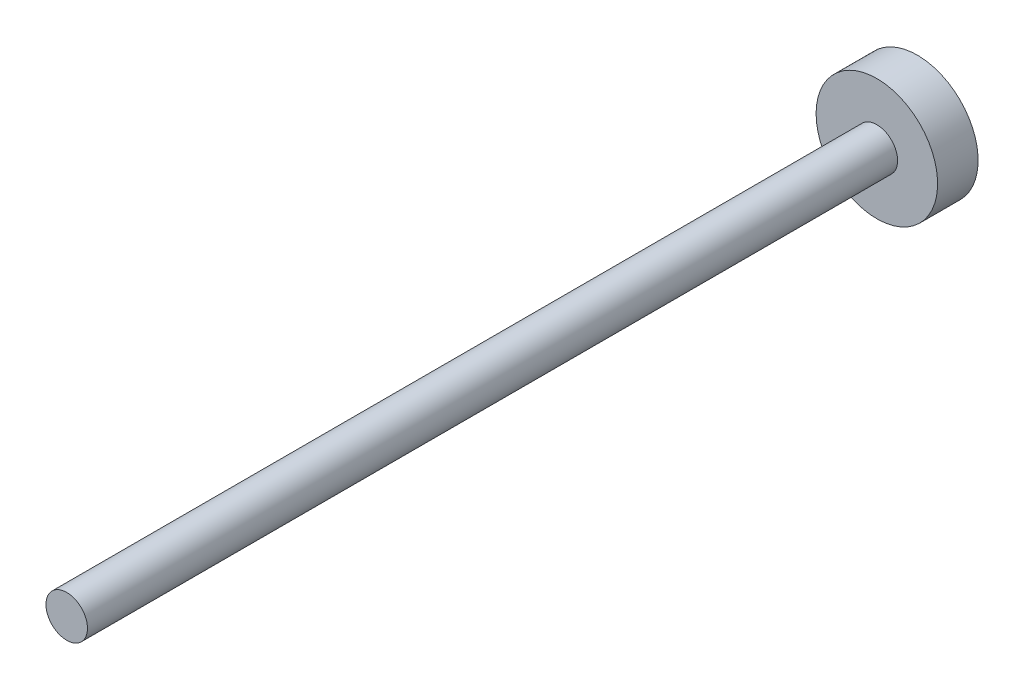
ISO-10303-21;
HEADER;
FILE_DESCRIPTION(('STEP AP214'),'2;1');
FILE_NAME('part.step','',(''),(''),'','','');
FILE_SCHEMA(('AUTOMOTIVE_DESIGN { 1 0 10303 214 1 1 1 1 }'));
ENDSEC;
DATA;
#1=APPLICATION_CONTEXT('core data for automotive mechanical design processes');
#2=APPLICATION_PROTOCOL_DEFINITION('international standard','automotive_design',2000,#1);
#3=PRODUCT_CONTEXT('',#1,'mechanical');
#4=PRODUCT('Part','Part','',(#3));
#5=PRODUCT_RELATED_PRODUCT_CATEGORY('part','',(#4));
#6=PRODUCT_DEFINITION_FORMATION('','',#4);
#7=PRODUCT_DEFINITION_CONTEXT('part definition',#1,'design');
#8=PRODUCT_DEFINITION('design','',#6,#7);
#9=PRODUCT_DEFINITION_SHAPE('','',#8);
#10=(LENGTH_UNIT() NAMED_UNIT(*) SI_UNIT(.MILLI.,.METRE.));
#11=(NAMED_UNIT(*) PLANE_ANGLE_UNIT() SI_UNIT($,.RADIAN.));
#12=(NAMED_UNIT(*) SI_UNIT($,.STERADIAN.) SOLID_ANGLE_UNIT());
#13=UNCERTAINTY_MEASURE_WITH_UNIT(LENGTH_MEASURE(1.E-05),#10,'distance_accuracy_value','');
#14=(GEOMETRIC_REPRESENTATION_CONTEXT(3) GLOBAL_UNCERTAINTY_ASSIGNED_CONTEXT((#13)) GLOBAL_UNIT_ASSIGNED_CONTEXT((#10,
#11,#12)) REPRESENTATION_CONTEXT('',''));
#15=CARTESIAN_POINT('',(0.,0.,0.));
#16=DIRECTION('',(0.,0.,1.));
#17=DIRECTION('',(1.,0.,0.));
#18=AXIS2_PLACEMENT_3D('',#15,#16,#17);
#19=CARTESIAN_POINT('',(0.,0.,80.));
#20=DIRECTION('',(0.,0.,-1.));
#21=DIRECTION('',(-1.,0.,0.));
#22=AXIS2_PLACEMENT_3D('',#19,#20,#21);
#23=CYLINDRICAL_SURFACE('',#22,2.05);
#24=CARTESIAN_POINT('',(0.,0.,80.));
#25=DIRECTION('',(0.,0.,1.));
#26=DIRECTION('',(1.,0.,0.));
#27=AXIS2_PLACEMENT_3D('',#24,#25,#26);
#28=CIRCLE('',#27,2.05);
#29=CARTESIAN_POINT('',(2.05,0.,80.));
#30=VERTEX_POINT('',#29);
#31=EDGE_CURVE('E10',#30,#30,#28,.T.);
#32=ORIENTED_EDGE('',*,*,#31,.F.);
#33=EDGE_LOOP('',(#32));
#34=FACE_BOUND('',#33,.T.);
#35=CARTESIAN_POINT('',(0.,0.,0.));
#36=DIRECTION('',(0.,0.,1.));
#37=DIRECTION('',(1.,0.,0.));
#38=AXIS2_PLACEMENT_3D('',#35,#36,#37);
#39=CIRCLE('',#38,2.05);
#40=CARTESIAN_POINT('',(2.05,0.,0.));
#41=VERTEX_POINT('',#40);
#42=EDGE_CURVE('E40',#41,#41,#39,.T.);
#43=ORIENTED_EDGE('',*,*,#42,.T.);
#44=EDGE_LOOP('',(#43));
#45=FACE_BOUND('',#44,.T.);
#46=ADVANCED_FACE('F37',(#34,#45),#23,.T.);
#47=CARTESIAN_POINT('',(0.,0.,80.));
#48=DIRECTION('',(0.,0.,1.));
#49=DIRECTION('',(1.,0.,0.));
#50=AXIS2_PLACEMENT_3D('',#47,#48,#49);
#51=PLANE('',#50);
#52=ORIENTED_EDGE('',*,*,#31,.T.);
#53=EDGE_LOOP('',(#52));
#54=FACE_BOUND('',#53,.T.);
#55=ADVANCED_FACE('F64',(#54),#51,.T.);
#56=CARTESIAN_POINT('',(0.,0.,-4.));
#57=DIRECTION('',(0.,0.,1.));
#58=DIRECTION('',(1.,0.,0.));
#59=AXIS2_PLACEMENT_3D('',#56,#57,#58);
#60=CYLINDRICAL_SURFACE('',#59,6.);
#61=CARTESIAN_POINT('',(0.,0.,-4.));
#62=DIRECTION('',(0.,0.,-1.));
#63=DIRECTION('',(-1.,0.,0.));
#64=AXIS2_PLACEMENT_3D('',#61,#62,#63);
#65=CIRCLE('',#64,6.);
#66=CARTESIAN_POINT('',(-6.,0.,-4.));
#67=VERTEX_POINT('',#66);
#68=EDGE_CURVE('E49',#67,#67,#65,.T.);
#69=ORIENTED_EDGE('',*,*,#68,.F.);
#70=EDGE_LOOP('',(#69));
#71=FACE_BOUND('',#70,.T.);
#72=CARTESIAN_POINT('',(0.,0.,0.));
#73=DIRECTION('',(0.,0.,-1.));
#74=DIRECTION('',(-1.,0.,0.));
#75=AXIS2_PLACEMENT_3D('',#72,#73,#74);
#76=CIRCLE('',#75,6.);
#77=CARTESIAN_POINT('',(-6.,0.,0.));
#78=VERTEX_POINT('',#77);
#79=EDGE_CURVE('E51',#78,#78,#76,.T.);
#80=ORIENTED_EDGE('',*,*,#79,.T.);
#81=EDGE_LOOP('',(#80));
#82=FACE_BOUND('',#81,.T.);
#83=ADVANCED_FACE('F61',(#71,#82),#60,.T.);
#84=CARTESIAN_POINT('',(0.,0.,-4.));
#85=DIRECTION('',(0.,0.,-1.));
#86=DIRECTION('',(-1.,0.,0.));
#87=AXIS2_PLACEMENT_3D('',#84,#85,#86);
#88=PLANE('',#87);
#89=ORIENTED_EDGE('',*,*,#68,.T.);
#90=EDGE_LOOP('',(#89));
#91=FACE_BOUND('',#90,.T.);
#92=ADVANCED_FACE('F59',(#91),#88,.T.);
#93=CARTESIAN_POINT('',(0.,0.,0.));
#94=DIRECTION('',(0.,0.,-1.));
#95=DIRECTION('',(-1.,0.,0.));
#96=AXIS2_PLACEMENT_3D('',#93,#94,#95);
#97=PLANE('',#96);
#98=ORIENTED_EDGE('',*,*,#42,.F.);
#99=EDGE_LOOP('',(#98));
#100=FACE_BOUND('',#99,.T.);
#101=ORIENTED_EDGE('',*,*,#79,.F.);
#102=EDGE_LOOP('',(#101));
#103=FACE_BOUND('',#102,.T.);
#104=ADVANCED_FACE('F68',(#100,#103),#97,.F.);
#105=CLOSED_SHELL('',(#46,#55,#83,#92,#104));
#106=MANIFOLD_SOLID_BREP('B2',#105);
#107=ADVANCED_BREP_SHAPE_REPRESENTATION('',(#18,#106),#14);
#108=SHAPE_DEFINITION_REPRESENTATION(#9,#107);
ENDSEC;
END-ISO-10303-21;
